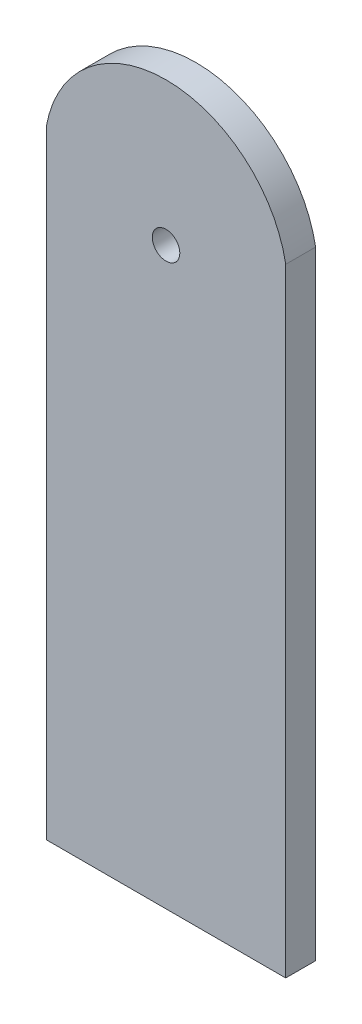
ISO-10303-21;
HEADER;
FILE_DESCRIPTION(('STEP AP214'),'2;1');
FILE_NAME('part.step','',(''),(''),'','','');
FILE_SCHEMA(('AUTOMOTIVE_DESIGN { 1 0 10303 214 1 1 1 1 }'));
ENDSEC;
DATA;
#1=APPLICATION_CONTEXT('core data for automotive mechanical design processes');
#2=APPLICATION_PROTOCOL_DEFINITION('international standard','automotive_design',2000,#1);
#3=PRODUCT_CONTEXT('',#1,'mechanical');
#4=PRODUCT('Part','Part','',(#3));
#5=PRODUCT_RELATED_PRODUCT_CATEGORY('part','',(#4));
#6=PRODUCT_DEFINITION_FORMATION('','',#4);
#7=PRODUCT_DEFINITION_CONTEXT('part definition',#1,'design');
#8=PRODUCT_DEFINITION('design','',#6,#7);
#9=PRODUCT_DEFINITION_SHAPE('','',#8);
#10=(LENGTH_UNIT() NAMED_UNIT(*) SI_UNIT(.MILLI.,.METRE.));
#11=(NAMED_UNIT(*) PLANE_ANGLE_UNIT() SI_UNIT($,.RADIAN.));
#12=(NAMED_UNIT(*) SI_UNIT($,.STERADIAN.) SOLID_ANGLE_UNIT());
#13=UNCERTAINTY_MEASURE_WITH_UNIT(LENGTH_MEASURE(1.E-05),#10,'distance_accuracy_value','');
#14=(GEOMETRIC_REPRESENTATION_CONTEXT(3) GLOBAL_UNCERTAINTY_ASSIGNED_CONTEXT((#13)) GLOBAL_UNIT_ASSIGNED_CONTEXT((#10,
#11,#12)) REPRESENTATION_CONTEXT('',''));
#15=CARTESIAN_POINT('',(0.,0.,0.));
#16=DIRECTION('',(0.,0.,1.));
#17=DIRECTION('',(1.,0.,0.));
#18=AXIS2_PLACEMENT_3D('',#15,#16,#17);
#19=CARTESIAN_POINT('',(12.7,63.2935594659989,3.175));
#20=DIRECTION('',(0.,0.,-1.));
#21=DIRECTION('',(-1.,0.,0.));
#22=AXIS2_PLACEMENT_3D('',#19,#20,#21);
#23=PLANE('',#22);
#24=DIRECTION('',(0.,-1.,0.));
#25=VECTOR('',#24,1.);
#26=CARTESIAN_POINT('',(0.,0.,3.175));
#27=LINE('',#26,#25);
#28=CARTESIAN_POINT('',(0.,65.5927348089656,3.175));
#29=VERTEX_POINT('',#28);
#30=CARTESIAN_POINT('',(0.,0.,3.175));
#31=VERTEX_POINT('',#30);
#32=EDGE_CURVE('E98',#29,#31,#27,.T.);
#33=ORIENTED_EDGE('',*,*,#32,.T.);
#34=DIRECTION('',(1.,0.,0.));
#35=VECTOR('',#34,1.);
#36=CARTESIAN_POINT('',(0.,0.,3.175));
#37=LINE('',#36,#35);
#38=CARTESIAN_POINT('',(25.4,0.,3.175));
#39=VERTEX_POINT('',#38);
#40=EDGE_CURVE('E93',#31,#39,#37,.T.);
#41=ORIENTED_EDGE('',*,*,#40,.T.);
#42=DIRECTION('',(0.,1.,0.));
#43=VECTOR('',#42,1.);
#44=CARTESIAN_POINT('',(25.4,0.,3.175));
#45=LINE('',#44,#43);
#46=CARTESIAN_POINT('',(25.4,65.5927348089656,3.175));
#47=VERTEX_POINT('',#46);
#48=EDGE_CURVE('E96',#39,#47,#45,.T.);
#49=ORIENTED_EDGE('',*,*,#48,.T.);
#50=CARTESIAN_POINT('',(12.7,63.2935594659989,3.175));
#51=DIRECTION('',(0.,0.,1.));
#52=DIRECTION('',(-1.,0.,0.));
#53=AXIS2_PLACEMENT_3D('',#50,#51,#52);
#54=CIRCLE('',#53,12.9064405340011);
#55=EDGE_CURVE('E63',#47,#29,#54,.T.);
#56=ORIENTED_EDGE('',*,*,#55,.T.);
#57=EDGE_LOOP('',(#33,#41,#49,#56));
#58=FACE_BOUND('',#57,.T.);
#59=CARTESIAN_POINT('',(12.7,60.9943841230322,3.175));
#60=DIRECTION('',(0.,0.,1.));
#61=DIRECTION('',(1.,0.,0.));
#62=AXIS2_PLACEMENT_3D('',#59,#60,#61);
#63=CIRCLE('',#62,1.4605);
#64=CARTESIAN_POINT('',(14.1605,60.9943841230322,3.175));
#65=VERTEX_POINT('',#64);
#66=EDGE_CURVE('E118',#65,#65,#63,.T.);
#67=ORIENTED_EDGE('',*,*,#66,.F.);
#68=EDGE_LOOP('',(#67));
#69=FACE_BOUND('',#68,.T.);
#70=ADVANCED_FACE('F45',(#58,#69),#23,.F.);
#71=CARTESIAN_POINT('',(12.7,63.2935594659989,0.));
#72=DIRECTION('',(0.,0.,-1.));
#73=DIRECTION('',(-1.,0.,0.));
#74=AXIS2_PLACEMENT_3D('',#71,#72,#73);
#75=PLANE('',#74);
#76=DIRECTION('',(0.,-1.,0.));
#77=VECTOR('',#76,1.);
#78=CARTESIAN_POINT('',(0.,0.,0.));
#79=LINE('',#78,#77);
#80=CARTESIAN_POINT('',(0.,65.5927348089656,0.));
#81=VERTEX_POINT('',#80);
#82=CARTESIAN_POINT('',(0.,0.,0.));
#83=VERTEX_POINT('',#82);
#84=EDGE_CURVE('E114',#81,#83,#79,.T.);
#85=ORIENTED_EDGE('',*,*,#84,.F.);
#86=CARTESIAN_POINT('',(12.7,63.2935594659989,0.));
#87=DIRECTION('',(0.,0.,1.));
#88=DIRECTION('',(-1.,0.,0.));
#89=AXIS2_PLACEMENT_3D('',#86,#87,#88);
#90=CIRCLE('',#89,12.9064405340011);
#91=CARTESIAN_POINT('',(25.4,65.5927348089656,0.));
#92=VERTEX_POINT('',#91);
#93=EDGE_CURVE('E86',#92,#81,#90,.T.);
#94=ORIENTED_EDGE('',*,*,#93,.F.);
#95=DIRECTION('',(0.,1.,0.));
#96=VECTOR('',#95,1.);
#97=CARTESIAN_POINT('',(25.4,0.,0.));
#98=LINE('',#97,#96);
#99=CARTESIAN_POINT('',(25.4,0.,0.));
#100=VERTEX_POINT('',#99);
#101=EDGE_CURVE('E80',#100,#92,#98,.T.);
#102=ORIENTED_EDGE('',*,*,#101,.F.);
#103=DIRECTION('',(1.,0.,0.));
#104=VECTOR('',#103,1.);
#105=CARTESIAN_POINT('',(0.,0.,0.));
#106=LINE('',#105,#104);
#107=EDGE_CURVE('E103',#83,#100,#106,.T.);
#108=ORIENTED_EDGE('',*,*,#107,.F.);
#109=EDGE_LOOP('',(#85,#94,#102,#108));
#110=FACE_BOUND('',#109,.T.);
#111=CARTESIAN_POINT('',(12.7,60.9943841230322,0.));
#112=DIRECTION('',(0.,0.,1.));
#113=DIRECTION('',(1.,0.,0.));
#114=AXIS2_PLACEMENT_3D('',#111,#112,#113);
#115=CIRCLE('',#114,1.4605);
#116=CARTESIAN_POINT('',(14.1605,60.9943841230322,0.));
#117=VERTEX_POINT('',#116);
#118=EDGE_CURVE('E136',#117,#117,#115,.T.);
#119=ORIENTED_EDGE('',*,*,#118,.T.);
#120=EDGE_LOOP('',(#119));
#121=FACE_BOUND('',#120,.T.);
#122=ADVANCED_FACE('F131',(#110,#121),#75,.T.);
#123=CARTESIAN_POINT('',(0.,0.,3.175));
#124=DIRECTION('',(1.,0.,0.));
#125=DIRECTION('',(0.,1.,0.));
#126=AXIS2_PLACEMENT_3D('',#123,#124,#125);
#127=PLANE('',#126);
#128=ORIENTED_EDGE('',*,*,#84,.T.);
#129=DIRECTION('',(0.,0.,-1.));
#130=VECTOR('',#129,1.);
#131=CARTESIAN_POINT('',(0.,0.,3.175));
#132=LINE('',#131,#130);
#133=EDGE_CURVE('E11',#31,#83,#132,.T.);
#134=ORIENTED_EDGE('',*,*,#133,.F.);
#135=ORIENTED_EDGE('',*,*,#32,.F.);
#136=DIRECTION('',(0.,0.,-1.));
#137=VECTOR('',#136,1.);
#138=CARTESIAN_POINT('',(0.,65.5927348089656,3.175));
#139=LINE('',#138,#137);
#140=EDGE_CURVE('E110',#29,#81,#139,.T.);
#141=ORIENTED_EDGE('',*,*,#140,.T.);
#142=EDGE_LOOP('',(#128,#134,#135,#141));
#143=FACE_BOUND('',#142,.T.);
#144=ADVANCED_FACE('F47',(#143),#127,.F.);
#145=CARTESIAN_POINT('',(0.,0.,3.175));
#146=DIRECTION('',(0.,1.,0.));
#147=DIRECTION('',(0.,0.,1.));
#148=AXIS2_PLACEMENT_3D('',#145,#146,#147);
#149=PLANE('',#148);
#150=ORIENTED_EDGE('',*,*,#107,.T.);
#151=DIRECTION('',(0.,0.,-1.));
#152=VECTOR('',#151,1.);
#153=CARTESIAN_POINT('',(25.4,0.,3.175));
#154=LINE('',#153,#152);
#155=EDGE_CURVE('E55',#39,#100,#154,.T.);
#156=ORIENTED_EDGE('',*,*,#155,.F.);
#157=ORIENTED_EDGE('',*,*,#40,.F.);
#158=ORIENTED_EDGE('',*,*,#133,.T.);
#159=EDGE_LOOP('',(#150,#156,#157,#158));
#160=FACE_BOUND('',#159,.T.);
#161=ADVANCED_FACE('F102',(#160),#149,.F.);
#162=CARTESIAN_POINT('',(25.4,0.,3.175));
#163=DIRECTION('',(-1.,0.,0.));
#164=DIRECTION('',(0.,-1.,0.));
#165=AXIS2_PLACEMENT_3D('',#162,#163,#164);
#166=PLANE('',#165);
#167=ORIENTED_EDGE('',*,*,#101,.T.);
#168=DIRECTION('',(0.,0.,-1.));
#169=VECTOR('',#168,1.);
#170=CARTESIAN_POINT('',(25.4,65.5927348089656,3.175));
#171=LINE('',#170,#169);
#172=EDGE_CURVE('E105',#47,#92,#171,.T.);
#173=ORIENTED_EDGE('',*,*,#172,.F.);
#174=ORIENTED_EDGE('',*,*,#48,.F.);
#175=ORIENTED_EDGE('',*,*,#155,.T.);
#176=EDGE_LOOP('',(#167,#173,#174,#175));
#177=FACE_BOUND('',#176,.T.);
#178=ADVANCED_FACE('F106',(#177),#166,.F.);
#179=CARTESIAN_POINT('',(12.7,63.2935594659989,3.175));
#180=DIRECTION('',(0.,0.,-1.));
#181=DIRECTION('',(-1.,0.,0.));
#182=AXIS2_PLACEMENT_3D('',#179,#180,#181);
#183=CYLINDRICAL_SURFACE('',#182,12.9064405340011);
#184=ORIENTED_EDGE('',*,*,#93,.T.);
#185=ORIENTED_EDGE('',*,*,#140,.F.);
#186=ORIENTED_EDGE('',*,*,#55,.F.);
#187=ORIENTED_EDGE('',*,*,#172,.T.);
#188=EDGE_LOOP('',(#184,#185,#186,#187));
#189=FACE_BOUND('',#188,.T.);
#190=ADVANCED_FACE('F128',(#189),#183,.T.);
#191=CARTESIAN_POINT('',(12.7,60.9943841230322,3.175));
#192=DIRECTION('',(0.,0.,-1.));
#193=DIRECTION('',(-1.,0.,0.));
#194=AXIS2_PLACEMENT_3D('',#191,#192,#193);
#195=CYLINDRICAL_SURFACE('',#194,1.4605);
#196=ORIENTED_EDGE('',*,*,#66,.T.);
#197=EDGE_LOOP('',(#196));
#198=FACE_BOUND('',#197,.T.);
#199=ORIENTED_EDGE('',*,*,#118,.F.);
#200=EDGE_LOOP('',(#199));
#201=FACE_BOUND('',#200,.T.);
#202=ADVANCED_FACE('F144',(#198,#201),#195,.F.);
#203=CLOSED_SHELL('',(#70,#122,#144,#161,#178,#190,#202));
#204=MANIFOLD_SOLID_BREP('B2',#203);
#205=ADVANCED_BREP_SHAPE_REPRESENTATION('',(#18,#204),#14);
#206=SHAPE_DEFINITION_REPRESENTATION(#9,#205);
ENDSEC;
END-ISO-10303-21;
